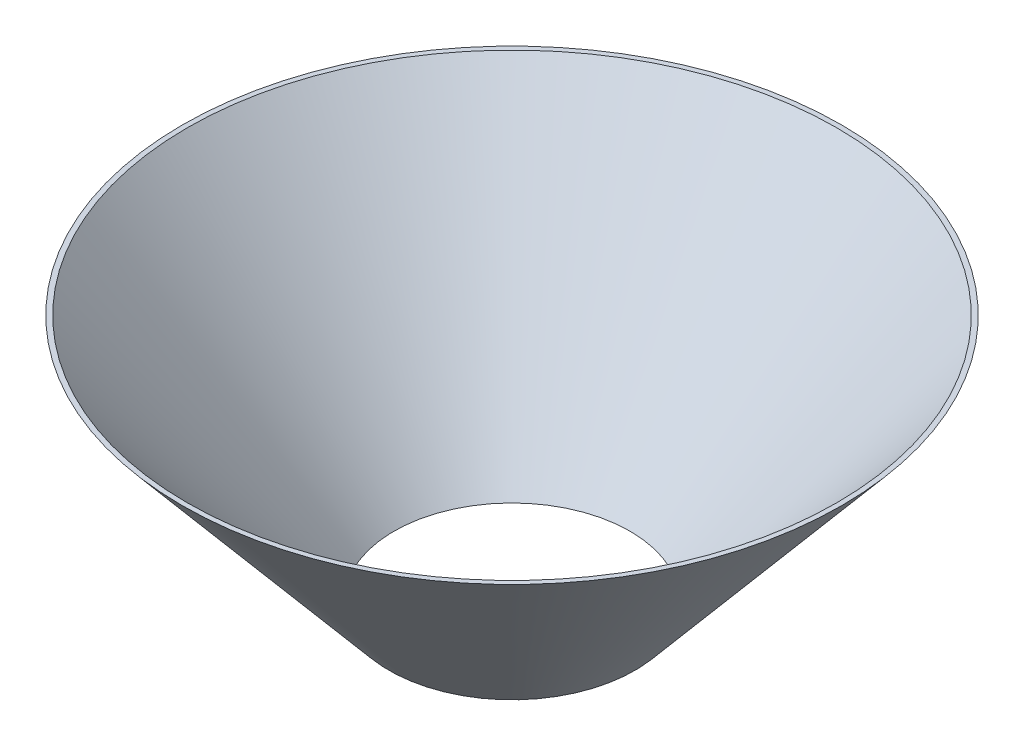
ISO-10303-21;
HEADER;
FILE_DESCRIPTION(('STEP AP214'),'2;1');
FILE_NAME('part.step','',(''),(''),'','','');
FILE_SCHEMA(('AUTOMOTIVE_DESIGN { 1 0 10303 214 1 1 1 1 }'));
ENDSEC;
DATA;
#1=APPLICATION_CONTEXT('core data for automotive mechanical design processes');
#2=APPLICATION_PROTOCOL_DEFINITION('international standard','automotive_design',2000,#1);
#3=PRODUCT_CONTEXT('',#1,'mechanical');
#4=PRODUCT('Part','Part','',(#3));
#5=PRODUCT_RELATED_PRODUCT_CATEGORY('part','',(#4));
#6=PRODUCT_DEFINITION_FORMATION('','',#4);
#7=PRODUCT_DEFINITION_CONTEXT('part definition',#1,'design');
#8=PRODUCT_DEFINITION('design','',#6,#7);
#9=PRODUCT_DEFINITION_SHAPE('','',#8);
#10=(LENGTH_UNIT() NAMED_UNIT(*) SI_UNIT(.MILLI.,.METRE.));
#11=(NAMED_UNIT(*) PLANE_ANGLE_UNIT() SI_UNIT($,.RADIAN.));
#12=(NAMED_UNIT(*) SI_UNIT($,.STERADIAN.) SOLID_ANGLE_UNIT());
#13=UNCERTAINTY_MEASURE_WITH_UNIT(LENGTH_MEASURE(1.E-05),#10,'distance_accuracy_value','');
#14=(GEOMETRIC_REPRESENTATION_CONTEXT(3) GLOBAL_UNCERTAINTY_ASSIGNED_CONTEXT((#13)) GLOBAL_UNIT_ASSIGNED_CONTEXT((#10,
#11,#12)) REPRESENTATION_CONTEXT('',''));
#15=CARTESIAN_POINT('',(0.,0.,0.));
#16=DIRECTION('',(0.,0.,1.));
#17=DIRECTION('',(1.,0.,0.));
#18=AXIS2_PLACEMENT_3D('',#15,#16,#17);
#19=CARTESIAN_POINT('',(-50.,91.8992230952591,0.));
#20=DIRECTION('',(0.,1.,0.));
#21=DIRECTION('',(0.,0.,1.));
#22=AXIS2_PLACEMENT_3D('',#19,#20,#21);
#23=PLANE('',#22);
#24=CARTESIAN_POINT('',(-50.,91.8992230952591,0.));
#25=DIRECTION('',(0.,-1.,0.));
#26=DIRECTION('',(0.,0.,-1.));
#27=AXIS2_PLACEMENT_3D('',#24,#25,#26);
#28=CIRCLE('',#27,132.);
#29=CARTESIAN_POINT('',(-50.,91.8992230952591,-132.));
#30=VERTEX_POINT('',#29);
#31=EDGE_CURVE('E45',#30,#30,#28,.T.);
#32=ORIENTED_EDGE('',*,*,#31,.T.);
#33=EDGE_LOOP('',(#32));
#34=FACE_BOUND('',#33,.T.);
#35=CARTESIAN_POINT('',(-50.,91.8992230952591,0.));
#36=DIRECTION('',(0.,-1.,0.));
#37=DIRECTION('',(0.,0.,-1.));
#38=AXIS2_PLACEMENT_3D('',#35,#36,#37);
#39=CIRCLE('',#38,134.);
#40=CARTESIAN_POINT('',(-50.,91.8992230952591,-134.));
#41=VERTEX_POINT('',#40);
#42=EDGE_CURVE('E10',#41,#41,#39,.T.);
#43=ORIENTED_EDGE('',*,*,#42,.F.);
#44=EDGE_LOOP('',(#43));
#45=FACE_BOUND('',#44,.T.);
#46=ADVANCED_FACE('F35',(#34,#45),#23,.T.);
#47=CARTESIAN_POINT('',(-50.,-8.10077690474088,0.));
#48=DIRECTION('',(0.,1.,0.));
#49=DIRECTION('',(0.,0.,1.));
#50=AXIS2_PLACEMENT_3D('',#47,#48,#49);
#51=CONICAL_SURFACE('',#50,50.,0.698659824721463);
#52=ORIENTED_EDGE('',*,*,#42,.T.);
#53=EDGE_LOOP('',(#52));
#54=FACE_BOUND('',#53,.T.);
#55=CARTESIAN_POINT('',(-50.,-8.10077690474088,0.));
#56=DIRECTION('',(0.,-1.,0.));
#57=DIRECTION('',(0.,0.,-1.));
#58=AXIS2_PLACEMENT_3D('',#55,#56,#57);
#59=CIRCLE('',#58,50.);
#60=CARTESIAN_POINT('',(-50.,-8.10077690474088,-50.));
#61=VERTEX_POINT('',#60);
#62=EDGE_CURVE('E41',#61,#61,#59,.T.);
#63=ORIENTED_EDGE('',*,*,#62,.F.);
#64=EDGE_LOOP('',(#63));
#65=FACE_BOUND('',#64,.T.);
#66=ADVANCED_FACE('F59',(#54,#65),#51,.T.);
#67=CARTESIAN_POINT('',(0.,-8.10077690474089,0.));
#68=DIRECTION('',(0.,-1.,0.));
#69=DIRECTION('',(0.,0.,-1.));
#70=AXIS2_PLACEMENT_3D('',#67,#68,#69);
#71=PLANE('',#70);
#72=CARTESIAN_POINT('',(-50.,-8.10077690474088,0.));
#73=DIRECTION('',(0.,-1.,0.));
#74=DIRECTION('',(0.,0.,-1.));
#75=AXIS2_PLACEMENT_3D('',#72,#73,#74);
#76=CIRCLE('',#75,48.);
#77=CARTESIAN_POINT('',(-50.,-8.10077690474088,-48.));
#78=VERTEX_POINT('',#77);
#79=EDGE_CURVE('E49',#78,#78,#76,.T.);
#80=ORIENTED_EDGE('',*,*,#79,.F.);
#81=EDGE_LOOP('',(#80));
#82=FACE_BOUND('',#81,.T.);
#83=ORIENTED_EDGE('',*,*,#62,.T.);
#84=EDGE_LOOP('',(#83));
#85=FACE_BOUND('',#84,.T.);
#86=ADVANCED_FACE('F57',(#82,#85),#71,.T.);
#87=CARTESIAN_POINT('',(-50.,-8.10077690474088,0.));
#88=DIRECTION('',(0.,1.,0.));
#89=DIRECTION('',(0.,0.,1.));
#90=AXIS2_PLACEMENT_3D('',#87,#88,#89);
#91=CONICAL_SURFACE('',#90,48.,0.698659824721463);
#92=ORIENTED_EDGE('',*,*,#31,.F.);
#93=EDGE_LOOP('',(#92));
#94=FACE_BOUND('',#93,.T.);
#95=ORIENTED_EDGE('',*,*,#79,.T.);
#96=EDGE_LOOP('',(#95));
#97=FACE_BOUND('',#96,.T.);
#98=ADVANCED_FACE('F55',(#94,#97),#91,.F.);
#99=CLOSED_SHELL('',(#46,#66,#86,#98));
#100=MANIFOLD_SOLID_BREP('B2',#99);
#101=ADVANCED_BREP_SHAPE_REPRESENTATION('',(#18,#100),#14);
#102=SHAPE_DEFINITION_REPRESENTATION(#9,#101);
ENDSEC;
END-ISO-10303-21;
